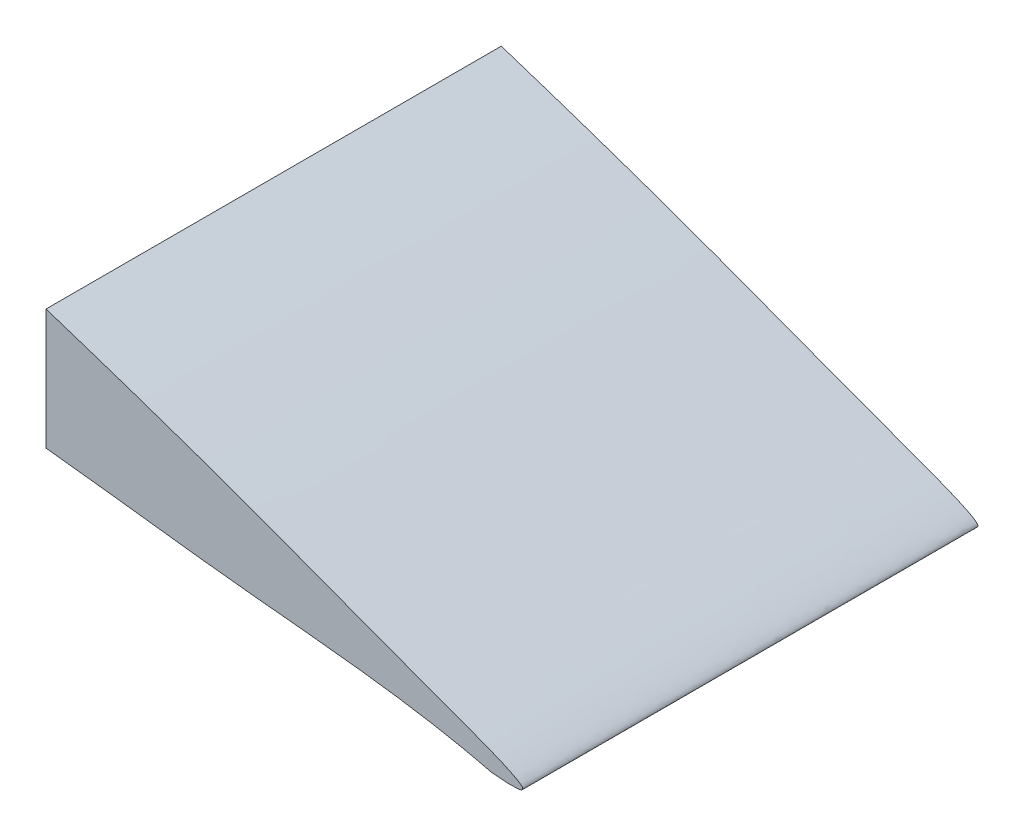
ISO-10303-21;
HEADER;
FILE_DESCRIPTION(('STEP AP214'),'2;1');
FILE_NAME('part.step','',(''),(''),'','','');
FILE_SCHEMA(('AUTOMOTIVE_DESIGN { 1 0 10303 214 1 1 1 1 }'));
ENDSEC;
DATA;
#1=APPLICATION_CONTEXT('core data for automotive mechanical design processes');
#2=APPLICATION_PROTOCOL_DEFINITION('international standard','automotive_design',2000,#1);
#3=PRODUCT_CONTEXT('',#1,'mechanical');
#4=PRODUCT('Part','Part','',(#3));
#5=PRODUCT_RELATED_PRODUCT_CATEGORY('part','',(#4));
#6=PRODUCT_DEFINITION_FORMATION('','',#4);
#7=PRODUCT_DEFINITION_CONTEXT('part definition',#1,'design');
#8=PRODUCT_DEFINITION('design','',#6,#7);
#9=PRODUCT_DEFINITION_SHAPE('','',#8);
#10=(LENGTH_UNIT() NAMED_UNIT(*) SI_UNIT(.MILLI.,.METRE.));
#11=(NAMED_UNIT(*) PLANE_ANGLE_UNIT() SI_UNIT($,.RADIAN.));
#12=(NAMED_UNIT(*) SI_UNIT($,.STERADIAN.) SOLID_ANGLE_UNIT());
#13=UNCERTAINTY_MEASURE_WITH_UNIT(LENGTH_MEASURE(1.E-05),#10,'distance_accuracy_value','');
#14=(GEOMETRIC_REPRESENTATION_CONTEXT(3) GLOBAL_UNCERTAINTY_ASSIGNED_CONTEXT((#13)) GLOBAL_UNIT_ASSIGNED_CONTEXT((#10,
#11,#12)) REPRESENTATION_CONTEXT('',''));
#15=CARTESIAN_POINT('',(0.,0.,0.));
#16=DIRECTION('',(0.,0.,1.));
#17=DIRECTION('',(1.,0.,0.));
#18=AXIS2_PLACEMENT_3D('',#15,#16,#17);
#19=CARTESIAN_POINT('',(0.000560351162113587,0.000130087070423624,31.1531));
#20=CARTESIAN_POINT('',(1.23071418869678,-6.92407609127206,31.1531));
#21=CARTESIAN_POINT('',(15.3166033306834,-6.18906584099094,31.1531));
#22=CARTESIAN_POINT('',(36.4546728163185,-6.09849990105009,31.1531));
#23=CARTESIAN_POINT('',(66.5061971849192,-0.586669106973501,31.1531));
#24=CARTESIAN_POINT('',(110.497331171581,6.18149522271792,31.1531));
#25=CARTESIAN_POINT('',(157.718638091679,9.03065014873911,31.1531));
#26=CARTESIAN_POINT('',(205.10142463584,8.83808028186313,31.1531));
#27=CARTESIAN_POINT('',(235.858814759408,7.87030619247826,31.1531));
#28=CARTESIAN_POINT('',(260.846344817159,5.42741339404395,31.1531));
#29=CARTESIAN_POINT('',(276.264022989737,4.51435670375389,31.1531));
#30=CARTESIAN_POINT('',(293.989507544058,2.09398731346533,31.1531));
#31=CARTESIAN_POINT('',(303.956832564589,1.47095520994628,31.1531));
#32=CARTESIAN_POINT('',(309.846313894505,0.000130087070423666,31.1531));
#33=B_SPLINE_CURVE_WITH_KNOTS('',3,(#19,#20,#21,#22,#23,#24,#25,#26,#27,#28,#29,#30,#31,#32),
.UNSPECIFIED.,.F.,.F.,(4,1,1,1,1,1,1,1,1,1,1,4),(0.,0.0569078595717698,0.106482711504673,
0.214488052979465,0.341297688349143,0.535095665520157,0.664680853556909,0.794660698192775,
0.828978881532905,0.904725108725214,0.942212919019968,1.),.UNSPECIFIED.);
#34=DIRECTION('',(0.,0.,-1.));
#35=VECTOR('',#34,1.);
#36=SURFACE_OF_LINEAR_EXTRUSION('',#33,#35);
#37=CARTESIAN_POINT('',(279.4,3.9633475918906,31.1531));
#38=VERTEX_POINT('',#37);
#39=CARTESIAN_POINT('',(309.846313894505,0.000130087070423864,31.1531));
#40=VERTEX_POINT('',#39);
#41=EDGE_CURVE('E64',#38,#40,#33,.T.);
#42=ORIENTED_EDGE('',*,*,#41,.F.);
#43=DIRECTION('',(0.,0.,-1.));
#44=VECTOR('',#43,1.);
#45=CARTESIAN_POINT('',(279.4,3.96334759085364,31.1531));
#46=LINE('',#45,#44);
#47=CARTESIAN_POINT('',(279.4,3.9633475918906,0.));
#48=VERTEX_POINT('',#47);
#49=EDGE_CURVE('E75',#38,#48,#46,.T.);
#50=ORIENTED_EDGE('',*,*,#49,.T.);
#51=CARTESIAN_POINT('',(0.000560351162113587,0.000130087070423624,0.));
#52=CARTESIAN_POINT('',(1.23071418869678,-6.92407609127206,0.));
#53=CARTESIAN_POINT('',(15.3166033306834,-6.18906584099094,0.));
#54=CARTESIAN_POINT('',(36.4546728163185,-6.09849990105009,0.));
#55=CARTESIAN_POINT('',(66.5061971849192,-0.586669106973501,0.));
#56=CARTESIAN_POINT('',(110.497331171581,6.18149522271792,0.));
#57=CARTESIAN_POINT('',(157.718638091679,9.03065014873911,0.));
#58=CARTESIAN_POINT('',(205.10142463584,8.83808028186313,0.));
#59=CARTESIAN_POINT('',(235.858814759408,7.87030619247826,0.));
#60=CARTESIAN_POINT('',(260.846344817159,5.42741339404395,0.));
#61=CARTESIAN_POINT('',(276.264022989737,4.51435670375389,0.));
#62=CARTESIAN_POINT('',(293.989507544058,2.09398731346533,0.));
#63=CARTESIAN_POINT('',(303.956832564589,1.47095520994628,0.));
#64=CARTESIAN_POINT('',(309.846313894505,0.000130087070423666,0.));
#65=B_SPLINE_CURVE_WITH_KNOTS('',3,(#51,#52,#53,#54,#55,#56,#57,#58,#59,#60,#61,#62,#63,#64),
.UNSPECIFIED.,.F.,.F.,(4,1,1,1,1,1,1,1,1,1,1,4),(0.,0.0569078595717698,0.106482711504673,
0.214488052979465,0.341297688349143,0.535095665520157,0.664680853556909,0.794660698192775,
0.828978881532905,0.904725108725214,0.942212919019968,1.),.UNSPECIFIED.);
#66=CARTESIAN_POINT('',(309.846313894505,0.000130087070423864,0.));
#67=VERTEX_POINT('',#66);
#68=EDGE_CURVE('E82',#48,#67,#65,.T.);
#69=ORIENTED_EDGE('',*,*,#68,.T.);
#70=DIRECTION('',(0.,0.,-1.));
#71=VECTOR('',#70,1.);
#72=CARTESIAN_POINT('',(309.846313894505,0.000130087070423864,31.1531));
#73=LINE('',#72,#71);
#74=EDGE_CURVE('E11',#40,#67,#73,.T.);
#75=ORIENTED_EDGE('',*,*,#74,.F.);
#76=EDGE_LOOP('',(#42,#50,#69,#75));
#77=FACE_BOUND('',#76,.T.);
#78=ADVANCED_FACE('F39',(#77),#36,.F.);
#79=CARTESIAN_POINT('',(309.846313894505,0.000130087070423864,31.1531));
#80=CARTESIAN_POINT('',(314.816918223261,-0.51620674157964,31.1531));
#81=CARTESIAN_POINT('',(301.273197720551,4.38282813873556,31.1531));
#82=CARTESIAN_POINT('',(290.359837670022,8.71099439045776,31.1531));
#83=CARTESIAN_POINT('',(256.952064400645,19.5289209482833,31.1531));
#84=CARTESIAN_POINT('',(217.961060472083,29.6129748944238,31.1531));
#85=CARTESIAN_POINT('',(173.256699242147,40.0411042779434,31.1531));
#86=CARTESIAN_POINT('',(131.400792108858,47.8848319151037,31.1531));
#87=CARTESIAN_POINT('',(89.5976184754884,49.290763053775,31.1531));
#88=CARTESIAN_POINT('',(52.1111282710831,42.0692152748914,31.1531));
#89=CARTESIAN_POINT('',(26.2867198183782,29.9751763284633,31.1531));
#90=CARTESIAN_POINT('',(8.64909202481883,17.8566051741579,31.1531));
#91=CARTESIAN_POINT('',(0.810633126632263,7.35919605469637,31.1531));
#92=CARTESIAN_POINT('',(0.000560351162116727,0.000130087070423829,31.1531));
#93=B_SPLINE_CURVE_WITH_KNOTS('',3,(#79,#80,#81,#82,#83,#84,#85,#86,#87,#88,#89,#90,#91,#92),
.UNSPECIFIED.,.F.,.F.,(4,1,1,1,1,1,1,1,1,1,1,4),(0.,0.0239417713693992,0.070244030177139,
0.147561721425381,0.308455887006792,0.442387865106874,0.551517565626309,0.687091076796298,
0.811391258419108,0.886311735305172,0.939136382225768,1.),.UNSPECIFIED.);
#94=DIRECTION('',(0.,0.,-1.));
#95=VECTOR('',#94,1.);
#96=SURFACE_OF_LINEAR_EXTRUSION('',#93,#95);
#97=CARTESIAN_POINT('',(309.846313894505,0.000130087070423864,0.));
#98=CARTESIAN_POINT('',(314.816918223261,-0.51620674157964,0.));
#99=CARTESIAN_POINT('',(301.273197720551,4.38282813873556,0.));
#100=CARTESIAN_POINT('',(290.359837670022,8.71099439045776,0.));
#101=CARTESIAN_POINT('',(256.952064400645,19.5289209482833,0.));
#102=CARTESIAN_POINT('',(217.961060472083,29.6129748944238,0.));
#103=CARTESIAN_POINT('',(173.256699242147,40.0411042779434,0.));
#104=CARTESIAN_POINT('',(131.400792108858,47.8848319151037,0.));
#105=CARTESIAN_POINT('',(89.5976184754884,49.290763053775,0.));
#106=CARTESIAN_POINT('',(52.1111282710831,42.0692152748914,0.));
#107=CARTESIAN_POINT('',(26.2867198183782,29.9751763284633,0.));
#108=CARTESIAN_POINT('',(8.64909202481883,17.8566051741579,0.));
#109=CARTESIAN_POINT('',(0.810633126632263,7.35919605469637,0.));
#110=CARTESIAN_POINT('',(0.000560351162116727,0.000130087070423829,0.));
#111=B_SPLINE_CURVE_WITH_KNOTS('',3,(#97,#98,#99,#100,#101,#102,#103,#104,#105,#106,#107,#108,
#109,#110),.UNSPECIFIED.,.F.,.F.,(4,1,1,1,1,1,1,1,1,1,1,4),(0.,0.0239417713693992,
0.070244030177139,0.147561721425381,0.308455887006792,0.442387865106874,0.551517565626309,
0.687091076796298,0.811391258419108,0.886311735305172,0.939136382225768,1.),.UNSPECIFIED.);
#112=CARTESIAN_POINT('',(279.40000000863,12.2074030819404,0.));
#113=VERTEX_POINT('',#112);
#114=EDGE_CURVE('E89',#67,#113,#111,.T.);
#115=ORIENTED_EDGE('',*,*,#114,.T.);
#116=DIRECTION('',(0.,0.,-1.));
#117=VECTOR('',#116,1.);
#118=CARTESIAN_POINT('',(279.4,12.2074030847446,31.1531));
#119=LINE('',#118,#117);
#120=CARTESIAN_POINT('',(279.4,12.2074030819404,31.1531));
#121=VERTEX_POINT('',#120);
#122=EDGE_CURVE('E55',#113,#121,#119,.F.);
#123=ORIENTED_EDGE('',*,*,#122,.T.);
#124=EDGE_CURVE('E48',#40,#121,#93,.T.);
#125=ORIENTED_EDGE('',*,*,#124,.F.);
#126=ORIENTED_EDGE('',*,*,#74,.T.);
#127=EDGE_LOOP('',(#115,#123,#125,#126));
#128=FACE_BOUND('',#127,.T.);
#129=ADVANCED_FACE('F110',(#128),#96,.F.);
#130=CARTESIAN_POINT('',(153.387816973495,8.33338198857885,31.1531));
#131=DIRECTION('',(0.,0.,-1.));
#132=DIRECTION('',(-1.,0.,0.));
#133=AXIS2_PLACEMENT_3D('',#130,#131,#132);
#134=PLANE('',#133);
#135=ORIENTED_EDGE('',*,*,#124,.T.);
#136=DIRECTION('',(0.,1.,0.));
#137=VECTOR('',#136,1.);
#138=CARTESIAN_POINT('',(279.4,-24.2165503945353,31.1531));
#139=LINE('',#138,#137);
#140=EDGE_CURVE('E77',#38,#121,#139,.T.);
#141=ORIENTED_EDGE('',*,*,#140,.F.);
#142=ORIENTED_EDGE('',*,*,#41,.T.);
#143=EDGE_LOOP('',(#135,#141,#142));
#144=FACE_BOUND('',#143,.T.);
#145=ADVANCED_FACE('F84',(#144),#134,.F.);
#146=CARTESIAN_POINT('',(153.387816973495,8.33338198857885,0.));
#147=DIRECTION('',(0.,0.,-1.));
#148=DIRECTION('',(-1.,0.,0.));
#149=AXIS2_PLACEMENT_3D('',#146,#147,#148);
#150=PLANE('',#149);
#151=DIRECTION('',(0.,1.,0.));
#152=VECTOR('',#151,1.);
#153=CARTESIAN_POINT('',(279.4,-24.2165503945353,0.));
#154=LINE('',#153,#152);
#155=EDGE_CURVE('E78',#48,#113,#154,.T.);
#156=ORIENTED_EDGE('',*,*,#155,.T.);
#157=ORIENTED_EDGE('',*,*,#114,.F.);
#158=ORIENTED_EDGE('',*,*,#68,.F.);
#159=EDGE_LOOP('',(#156,#157,#158));
#160=FACE_BOUND('',#159,.T.);
#161=ADVANCED_FACE('F114',(#160),#150,.T.);
#162=CARTESIAN_POINT('',(279.4,-24.2165503945353,0.));
#163=DIRECTION('',(1.,0.,0.));
#164=DIRECTION('',(0.,0.,-1.));
#165=AXIS2_PLACEMENT_3D('',#162,#163,#164);
#166=PLANE('',#165);
#167=ORIENTED_EDGE('',*,*,#140,.T.);
#168=ORIENTED_EDGE('',*,*,#122,.F.);
#169=ORIENTED_EDGE('',*,*,#155,.F.);
#170=ORIENTED_EDGE('',*,*,#49,.F.);
#171=EDGE_LOOP('',(#167,#168,#169,#170));
#172=FACE_BOUND('',#171,.T.);
#173=ADVANCED_FACE('F76',(#172),#166,.F.);
#174=CLOSED_SHELL('',(#78,#129,#145,#161,#173));
#175=MANIFOLD_SOLID_BREP('B2',#174);
#176=ADVANCED_BREP_SHAPE_REPRESENTATION('',(#18,#175),#14);
#177=SHAPE_DEFINITION_REPRESENTATION(#9,#176);
ENDSEC;
END-ISO-10303-21;
